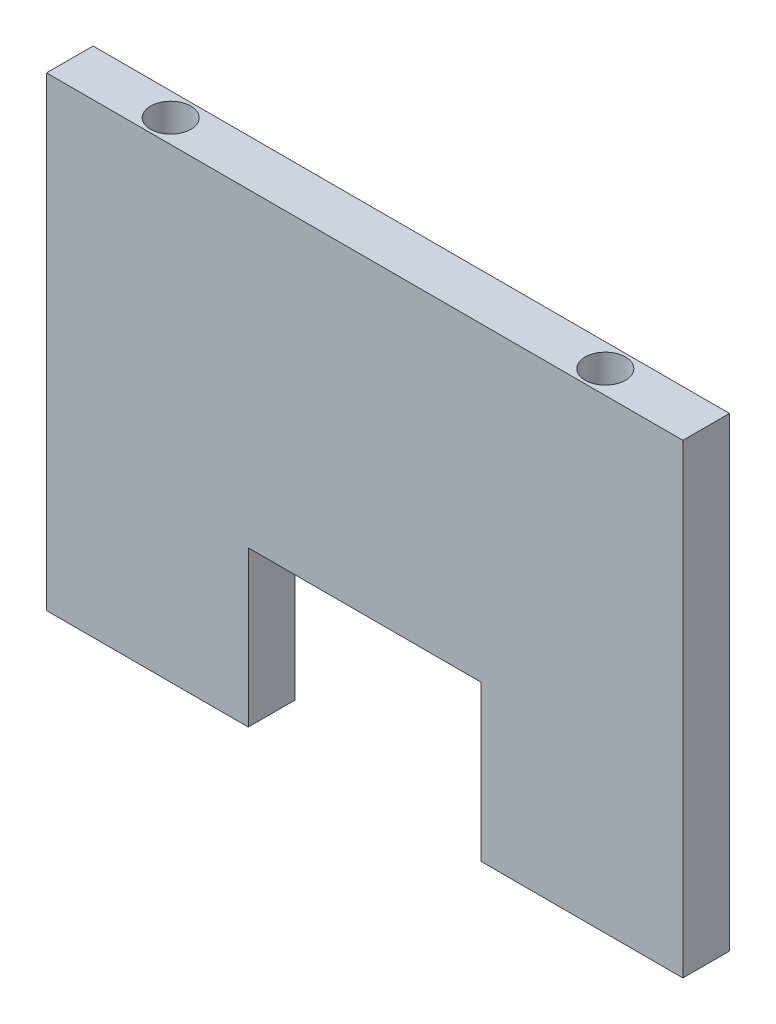
ISO-10303-21;
HEADER;
FILE_DESCRIPTION(('STEP AP214'),'2;1');
FILE_NAME('part.step','',(''),(''),'','','');
FILE_SCHEMA(('AUTOMOTIVE_DESIGN { 1 0 10303 214 1 1 1 1 }'));
ENDSEC;
DATA;
#1=APPLICATION_CONTEXT('core data for automotive mechanical design processes');
#2=APPLICATION_PROTOCOL_DEFINITION('international standard','automotive_design',2000,#1);
#3=PRODUCT_CONTEXT('',#1,'mechanical');
#4=PRODUCT('Part','Part','',(#3));
#5=PRODUCT_RELATED_PRODUCT_CATEGORY('part','',(#4));
#6=PRODUCT_DEFINITION_FORMATION('','',#4);
#7=PRODUCT_DEFINITION_CONTEXT('part definition',#1,'design');
#8=PRODUCT_DEFINITION('design','',#6,#7);
#9=PRODUCT_DEFINITION_SHAPE('','',#8);
#10=(LENGTH_UNIT() NAMED_UNIT(*) SI_UNIT(.MILLI.,.METRE.));
#11=(NAMED_UNIT(*) PLANE_ANGLE_UNIT() SI_UNIT($,.RADIAN.));
#12=(NAMED_UNIT(*) SI_UNIT($,.STERADIAN.) SOLID_ANGLE_UNIT());
#13=UNCERTAINTY_MEASURE_WITH_UNIT(LENGTH_MEASURE(1.E-05),#10,'distance_accuracy_value','');
#14=(GEOMETRIC_REPRESENTATION_CONTEXT(3) GLOBAL_UNCERTAINTY_ASSIGNED_CONTEXT((#13)) GLOBAL_UNIT_ASSIGNED_CONTEXT((#10,
#11,#12)) REPRESENTATION_CONTEXT('',''));
#15=CARTESIAN_POINT('',(0.,0.,0.));
#16=DIRECTION('',(0.,0.,1.));
#17=DIRECTION('',(1.,0.,0.));
#18=AXIS2_PLACEMENT_3D('',#15,#16,#17);
#19=CARTESIAN_POINT('',(0.,0.,3.81));
#20=DIRECTION('',(0.,1.,0.));
#21=DIRECTION('',(0.,0.,1.));
#22=AXIS2_PLACEMENT_3D('',#19,#20,#21);
#23=PLANE('',#22);
#24=CARTESIAN_POINT('',(43.815,0.,1.905));
#25=DIRECTION('',(0.,-1.,0.));
#26=DIRECTION('',(0.,0.,-1.));
#27=AXIS2_PLACEMENT_3D('',#24,#25,#26);
#28=CIRCLE('',#27,1.651);
#29=CARTESIAN_POINT('',(43.815,0.,0.254000000000001));
#30=VERTEX_POINT('',#29);
#31=EDGE_CURVE('E136',#30,#30,#28,.T.);
#32=ORIENTED_EDGE('',*,*,#31,.F.);
#33=EDGE_LOOP('',(#32));
#34=FACE_BOUND('',#33,.T.);
#35=DIRECTION('',(1.,0.,0.));
#36=VECTOR('',#35,1.);
#37=CARTESIAN_POINT('',(0.,0.,3.81));
#38=LINE('',#37,#36);
#39=CARTESIAN_POINT('',(35.56,0.,3.81));
#40=VERTEX_POINT('',#39);
#41=CARTESIAN_POINT('',(52.07,0.,3.81));
#42=VERTEX_POINT('',#41);
#43=EDGE_CURVE('E151',#40,#42,#38,.T.);
#44=ORIENTED_EDGE('',*,*,#43,.F.);
#45=DIRECTION('',(0.,0.,1.));
#46=VECTOR('',#45,1.);
#47=CARTESIAN_POINT('',(35.56,0.,0.));
#48=LINE('',#47,#46);
#49=CARTESIAN_POINT('',(35.56,0.,0.));
#50=VERTEX_POINT('',#49);
#51=EDGE_CURVE('E143',#50,#40,#48,.T.);
#52=ORIENTED_EDGE('',*,*,#51,.F.);
#53=DIRECTION('',(1.,0.,0.));
#54=VECTOR('',#53,1.);
#55=CARTESIAN_POINT('',(0.,0.,0.));
#56=LINE('',#55,#54);
#57=CARTESIAN_POINT('',(52.07,0.,0.));
#58=VERTEX_POINT('',#57);
#59=EDGE_CURVE('E130',#50,#58,#56,.T.);
#60=ORIENTED_EDGE('',*,*,#59,.T.);
#61=DIRECTION('',(0.,0.,-1.));
#62=VECTOR('',#61,1.);
#63=CARTESIAN_POINT('',(52.07,0.,3.81));
#64=LINE('',#63,#62);
#65=EDGE_CURVE('E43',#42,#58,#64,.T.);
#66=ORIENTED_EDGE('',*,*,#65,.F.);
#67=EDGE_LOOP('',(#44,#52,#60,#66));
#68=FACE_BOUND('',#67,.T.);
#69=ADVANCED_FACE('F35',(#34,#68),#23,.F.);
#70=CARTESIAN_POINT('',(0.,0.,3.81));
#71=DIRECTION('',(1.,0.,0.));
#72=DIRECTION('',(0.,0.,-1.));
#73=AXIS2_PLACEMENT_3D('',#70,#71,#72);
#74=PLANE('',#73);
#75=DIRECTION('',(0.,-1.,0.));
#76=VECTOR('',#75,1.);
#77=CARTESIAN_POINT('',(0.,0.,0.));
#78=LINE('',#77,#76);
#79=CARTESIAN_POINT('',(0.,38.1,0.));
#80=VERTEX_POINT('',#79);
#81=CARTESIAN_POINT('',(0.,0.,0.));
#82=VERTEX_POINT('',#81);
#83=EDGE_CURVE('E145',#80,#82,#78,.T.);
#84=ORIENTED_EDGE('',*,*,#83,.T.);
#85=DIRECTION('',(0.,0.,-1.));
#86=VECTOR('',#85,1.);
#87=CARTESIAN_POINT('',(0.,0.,3.81));
#88=LINE('',#87,#86);
#89=CARTESIAN_POINT('',(0.,0.,3.81));
#90=VERTEX_POINT('',#89);
#91=EDGE_CURVE('E11',#90,#82,#88,.T.);
#92=ORIENTED_EDGE('',*,*,#91,.F.);
#93=DIRECTION('',(0.,-1.,0.));
#94=VECTOR('',#93,1.);
#95=CARTESIAN_POINT('',(0.,0.,3.81));
#96=LINE('',#95,#94);
#97=CARTESIAN_POINT('',(0.,38.1,3.81));
#98=VERTEX_POINT('',#97);
#99=EDGE_CURVE('E149',#98,#90,#96,.T.);
#100=ORIENTED_EDGE('',*,*,#99,.F.);
#101=DIRECTION('',(0.,0.,-1.));
#102=VECTOR('',#101,1.);
#103=CARTESIAN_POINT('',(0.,38.1,3.81));
#104=LINE('',#103,#102);
#105=EDGE_CURVE('E156',#98,#80,#104,.T.);
#106=ORIENTED_EDGE('',*,*,#105,.T.);
#107=EDGE_LOOP('',(#84,#92,#100,#106));
#108=FACE_BOUND('',#107,.T.);
#109=ADVANCED_FACE('F37',(#108),#74,.F.);
#110=CARTESIAN_POINT('',(8.255,0.,1.905));
#111=DIRECTION('',(0.,-1.,0.));
#112=DIRECTION('',(0.,0.,-1.));
#113=AXIS2_PLACEMENT_3D('',#110,#111,#112);
#114=CIRCLE('',#113,1.651);
#115=CARTESIAN_POINT('',(8.255,0.,0.254000000000001));
#116=VERTEX_POINT('',#115);
#117=EDGE_CURVE('E206',#116,#116,#114,.T.);
#118=ORIENTED_EDGE('',*,*,#117,.F.);
#119=EDGE_LOOP('',(#118));
#120=FACE_BOUND('',#119,.T.);
#121=CARTESIAN_POINT('',(16.51,0.,0.));
#122=VERTEX_POINT('',#121);
#123=EDGE_CURVE('E159',#82,#122,#56,.T.);
#124=ORIENTED_EDGE('',*,*,#123,.T.);
#125=DIRECTION('',(0.,0.,1.));
#126=VECTOR('',#125,1.);
#127=CARTESIAN_POINT('',(16.51,0.,0.));
#128=LINE('',#127,#126);
#129=CARTESIAN_POINT('',(16.51,0.,3.81));
#130=VERTEX_POINT('',#129);
#131=EDGE_CURVE('E146',#122,#130,#128,.T.);
#132=ORIENTED_EDGE('',*,*,#131,.T.);
#133=EDGE_CURVE('E87',#90,#130,#38,.T.);
#134=ORIENTED_EDGE('',*,*,#133,.F.);
#135=ORIENTED_EDGE('',*,*,#91,.T.);
#136=EDGE_LOOP('',(#124,#132,#134,#135));
#137=FACE_BOUND('',#136,.T.);
#138=ADVANCED_FACE('F189',(#120,#137),#23,.F.);
#139=CARTESIAN_POINT('',(52.07,0.,3.81));
#140=DIRECTION('',(-1.,0.,0.));
#141=DIRECTION('',(0.,0.,1.));
#142=AXIS2_PLACEMENT_3D('',#139,#140,#141);
#143=PLANE('',#142);
#144=DIRECTION('',(0.,1.,0.));
#145=VECTOR('',#144,1.);
#146=CARTESIAN_POINT('',(52.07,0.,0.));
#147=LINE('',#146,#145);
#148=CARTESIAN_POINT('',(52.07,38.1,0.));
#149=VERTEX_POINT('',#148);
#150=EDGE_CURVE('E162',#58,#149,#147,.T.);
#151=ORIENTED_EDGE('',*,*,#150,.T.);
#152=DIRECTION('',(0.,0.,-1.));
#153=VECTOR('',#152,1.);
#154=CARTESIAN_POINT('',(52.07,38.1,3.81));
#155=LINE('',#154,#153);
#156=CARTESIAN_POINT('',(52.07,38.1,3.81));
#157=VERTEX_POINT('',#156);
#158=EDGE_CURVE('E166',#157,#149,#155,.T.);
#159=ORIENTED_EDGE('',*,*,#158,.F.);
#160=DIRECTION('',(0.,1.,0.));
#161=VECTOR('',#160,1.);
#162=CARTESIAN_POINT('',(52.07,0.,3.81));
#163=LINE('',#162,#161);
#164=EDGE_CURVE('E153',#42,#157,#163,.T.);
#165=ORIENTED_EDGE('',*,*,#164,.F.);
#166=ORIENTED_EDGE('',*,*,#65,.T.);
#167=EDGE_LOOP('',(#151,#159,#165,#166));
#168=FACE_BOUND('',#167,.T.);
#169=ADVANCED_FACE('F171',(#168),#143,.F.);
#170=CARTESIAN_POINT('',(0.,38.1,3.81));
#171=DIRECTION('',(0.,-1.,0.));
#172=DIRECTION('',(0.,0.,-1.));
#173=AXIS2_PLACEMENT_3D('',#170,#171,#172);
#174=PLANE('',#173);
#175=CARTESIAN_POINT('',(8.255,38.1,1.905));
#176=DIRECTION('',(0.,1.,0.));
#177=DIRECTION('',(0.,0.,1.));
#178=AXIS2_PLACEMENT_3D('',#175,#176,#177);
#179=CIRCLE('',#178,1.651);
#180=CARTESIAN_POINT('',(8.255,38.1,3.556));
#181=VERTEX_POINT('',#180);
#182=EDGE_CURVE('E338',#181,#181,#179,.T.);
#183=ORIENTED_EDGE('',*,*,#182,.F.);
#184=EDGE_LOOP('',(#183));
#185=FACE_BOUND('',#184,.T.);
#186=CARTESIAN_POINT('',(43.815,38.1,1.905));
#187=DIRECTION('',(0.,1.,0.));
#188=DIRECTION('',(0.,0.,1.));
#189=AXIS2_PLACEMENT_3D('',#186,#187,#188);
#190=CIRCLE('',#189,1.651);
#191=CARTESIAN_POINT('',(43.815,38.1,3.556));
#192=VERTEX_POINT('',#191);
#193=EDGE_CURVE('E348',#192,#192,#190,.T.);
#194=ORIENTED_EDGE('',*,*,#193,.F.);
#195=EDGE_LOOP('',(#194));
#196=FACE_BOUND('',#195,.T.);
#197=DIRECTION('',(-1.,0.,0.));
#198=VECTOR('',#197,1.);
#199=CARTESIAN_POINT('',(0.,38.1,0.));
#200=LINE('',#199,#198);
#201=EDGE_CURVE('E80',#149,#80,#200,.T.);
#202=ORIENTED_EDGE('',*,*,#201,.T.);
#203=ORIENTED_EDGE('',*,*,#105,.F.);
#204=DIRECTION('',(-1.,0.,0.));
#205=VECTOR('',#204,1.);
#206=CARTESIAN_POINT('',(0.,38.1,3.81));
#207=LINE('',#206,#205);
#208=EDGE_CURVE('E59',#157,#98,#207,.T.);
#209=ORIENTED_EDGE('',*,*,#208,.F.);
#210=ORIENTED_EDGE('',*,*,#158,.T.);
#211=EDGE_LOOP('',(#202,#203,#209,#210));
#212=FACE_BOUND('',#211,.T.);
#213=ADVANCED_FACE('F179',(#185,#196,#212),#174,.F.);
#214=CARTESIAN_POINT('',(0.,0.,3.81));
#215=DIRECTION('',(0.,0.,-1.));
#216=DIRECTION('',(-1.,0.,0.));
#217=AXIS2_PLACEMENT_3D('',#214,#215,#216);
#218=PLANE('',#217);
#219=DIRECTION('',(-1.,0.,0.));
#220=VECTOR('',#219,1.);
#221=CARTESIAN_POINT('',(16.51,12.7,3.81));
#222=LINE('',#221,#220);
#223=CARTESIAN_POINT('',(35.56,12.7,3.81));
#224=VERTEX_POINT('',#223);
#225=CARTESIAN_POINT('',(16.51,12.7,3.81));
#226=VERTEX_POINT('',#225);
#227=EDGE_CURVE('E133',#224,#226,#222,.T.);
#228=ORIENTED_EDGE('',*,*,#227,.F.);
#229=DIRECTION('',(0.,1.,0.));
#230=VECTOR('',#229,1.);
#231=CARTESIAN_POINT('',(35.56,12.7,3.81));
#232=LINE('',#231,#230);
#233=EDGE_CURVE('E116',#40,#224,#232,.T.);
#234=ORIENTED_EDGE('',*,*,#233,.F.);
#235=ORIENTED_EDGE('',*,*,#43,.T.);
#236=ORIENTED_EDGE('',*,*,#164,.T.);
#237=ORIENTED_EDGE('',*,*,#208,.T.);
#238=ORIENTED_EDGE('',*,*,#99,.T.);
#239=ORIENTED_EDGE('',*,*,#133,.T.);
#240=DIRECTION('',(0.,-1.,0.));
#241=VECTOR('',#240,1.);
#242=CARTESIAN_POINT('',(16.51,12.7,3.81));
#243=LINE('',#242,#241);
#244=EDGE_CURVE('E131',#226,#130,#243,.T.);
#245=ORIENTED_EDGE('',*,*,#244,.F.);
#246=EDGE_LOOP('',(#228,#234,#235,#236,#237,#238,#239,#245));
#247=FACE_BOUND('',#246,.T.);
#248=ADVANCED_FACE('F181',(#247),#218,.F.);
#249=CARTESIAN_POINT('',(0.,0.,0.));
#250=DIRECTION('',(0.,0.,-1.));
#251=DIRECTION('',(-1.,0.,0.));
#252=AXIS2_PLACEMENT_3D('',#249,#250,#251);
#253=PLANE('',#252);
#254=DIRECTION('',(0.,1.,0.));
#255=VECTOR('',#254,1.);
#256=CARTESIAN_POINT('',(35.56,12.7,0.));
#257=LINE('',#256,#255);
#258=CARTESIAN_POINT('',(35.56,12.7,0.));
#259=VERTEX_POINT('',#258);
#260=EDGE_CURVE('E113',#50,#259,#257,.T.);
#261=ORIENTED_EDGE('',*,*,#260,.T.);
#262=DIRECTION('',(-1.,0.,0.));
#263=VECTOR('',#262,1.);
#264=CARTESIAN_POINT('',(16.51,12.7,0.));
#265=LINE('',#264,#263);
#266=CARTESIAN_POINT('',(16.51,12.7,0.));
#267=VERTEX_POINT('',#266);
#268=EDGE_CURVE('E123',#259,#267,#265,.T.);
#269=ORIENTED_EDGE('',*,*,#268,.T.);
#270=DIRECTION('',(0.,-1.,0.));
#271=VECTOR('',#270,1.);
#272=CARTESIAN_POINT('',(16.51,12.7,0.));
#273=LINE('',#272,#271);
#274=EDGE_CURVE('E50',#267,#122,#273,.T.);
#275=ORIENTED_EDGE('',*,*,#274,.T.);
#276=ORIENTED_EDGE('',*,*,#123,.F.);
#277=ORIENTED_EDGE('',*,*,#83,.F.);
#278=ORIENTED_EDGE('',*,*,#201,.F.);
#279=ORIENTED_EDGE('',*,*,#150,.F.);
#280=ORIENTED_EDGE('',*,*,#59,.F.);
#281=EDGE_LOOP('',(#261,#269,#275,#276,#277,#278,#279,#280));
#282=FACE_BOUND('',#281,.T.);
#283=ADVANCED_FACE('F128',(#282),#253,.T.);
#284=CARTESIAN_POINT('',(35.56,12.7,0.));
#285=DIRECTION('',(1.,0.,0.));
#286=DIRECTION('',(0.,0.,-1.));
#287=AXIS2_PLACEMENT_3D('',#284,#285,#286);
#288=PLANE('',#287);
#289=ORIENTED_EDGE('',*,*,#233,.T.);
#290=DIRECTION('',(0.,0.,1.));
#291=VECTOR('',#290,1.);
#292=CARTESIAN_POINT('',(35.56,12.7,0.));
#293=LINE('',#292,#291);
#294=EDGE_CURVE('E109',#259,#224,#293,.T.);
#295=ORIENTED_EDGE('',*,*,#294,.F.);
#296=ORIENTED_EDGE('',*,*,#260,.F.);
#297=ORIENTED_EDGE('',*,*,#51,.T.);
#298=EDGE_LOOP('',(#289,#295,#296,#297));
#299=FACE_BOUND('',#298,.T.);
#300=ADVANCED_FACE('F111',(#299),#288,.F.);
#301=CARTESIAN_POINT('',(16.51,12.7,0.));
#302=DIRECTION('',(-1.,0.,0.));
#303=DIRECTION('',(0.,0.,1.));
#304=AXIS2_PLACEMENT_3D('',#301,#302,#303);
#305=PLANE('',#304);
#306=ORIENTED_EDGE('',*,*,#244,.T.);
#307=ORIENTED_EDGE('',*,*,#131,.F.);
#308=ORIENTED_EDGE('',*,*,#274,.F.);
#309=DIRECTION('',(0.,0.,1.));
#310=VECTOR('',#309,1.);
#311=CARTESIAN_POINT('',(16.51,12.7,0.));
#312=LINE('',#311,#310);
#313=EDGE_CURVE('E120',#267,#226,#312,.T.);
#314=ORIENTED_EDGE('',*,*,#313,.T.);
#315=EDGE_LOOP('',(#306,#307,#308,#314));
#316=FACE_BOUND('',#315,.T.);
#317=ADVANCED_FACE('F208',(#316),#305,.F.);
#318=CARTESIAN_POINT('',(16.51,12.7,0.));
#319=DIRECTION('',(0.,1.,0.));
#320=DIRECTION('',(0.,0.,1.));
#321=AXIS2_PLACEMENT_3D('',#318,#319,#320);
#322=PLANE('',#321);
#323=ORIENTED_EDGE('',*,*,#227,.T.);
#324=ORIENTED_EDGE('',*,*,#313,.F.);
#325=ORIENTED_EDGE('',*,*,#268,.F.);
#326=ORIENTED_EDGE('',*,*,#294,.T.);
#327=EDGE_LOOP('',(#323,#324,#325,#326));
#328=FACE_BOUND('',#327,.T.);
#329=ADVANCED_FACE('F124',(#328),#322,.F.);
#330=CARTESIAN_POINT('',(8.255,5.08,1.905));
#331=DIRECTION('',(0.,-1.,0.));
#332=DIRECTION('',(0.,0.,-1.));
#333=AXIS2_PLACEMENT_3D('',#330,#331,#332);
#334=CYLINDRICAL_SURFACE('',#333,1.651);
#335=CARTESIAN_POINT('',(8.255,5.08,1.905));
#336=DIRECTION('',(0.,-1.,0.));
#337=DIRECTION('',(0.,0.,-1.));
#338=AXIS2_PLACEMENT_3D('',#335,#336,#337);
#339=CIRCLE('',#338,1.651);
#340=CARTESIAN_POINT('',(8.255,5.08,0.254000000000001));
#341=VERTEX_POINT('',#340);
#342=EDGE_CURVE('E141',#341,#341,#339,.T.);
#343=ORIENTED_EDGE('',*,*,#342,.F.);
#344=EDGE_LOOP('',(#343));
#345=FACE_BOUND('',#344,.T.);
#346=ORIENTED_EDGE('',*,*,#117,.T.);
#347=EDGE_LOOP('',(#346));
#348=FACE_BOUND('',#347,.T.);
#349=ADVANCED_FACE('F215',(#345,#348),#334,.F.);
#350=CARTESIAN_POINT('',(8.255,5.08,1.905));
#351=DIRECTION('',(0.,-1.,0.));
#352=DIRECTION('',(0.,0.,-1.));
#353=AXIS2_PLACEMENT_3D('',#350,#351,#352);
#354=PLANE('',#353);
#355=ORIENTED_EDGE('',*,*,#342,.T.);
#356=EDGE_LOOP('',(#355));
#357=FACE_BOUND('',#356,.T.);
#358=ADVANCED_FACE('F259',(#357),#354,.T.);
#359=CARTESIAN_POINT('',(43.815,5.08,1.905));
#360=DIRECTION('',(0.,-1.,0.));
#361=DIRECTION('',(0.,0.,-1.));
#362=AXIS2_PLACEMENT_3D('',#359,#360,#361);
#363=CYLINDRICAL_SURFACE('',#362,1.651);
#364=CARTESIAN_POINT('',(43.815,5.08,1.905));
#365=DIRECTION('',(0.,-1.,0.));
#366=DIRECTION('',(0.,0.,-1.));
#367=AXIS2_PLACEMENT_3D('',#364,#365,#366);
#368=CIRCLE('',#367,1.651);
#369=CARTESIAN_POINT('',(43.815,5.08,0.254000000000001));
#370=VERTEX_POINT('',#369);
#371=EDGE_CURVE('E341',#370,#370,#368,.T.);
#372=ORIENTED_EDGE('',*,*,#371,.F.);
#373=EDGE_LOOP('',(#372));
#374=FACE_BOUND('',#373,.T.);
#375=ORIENTED_EDGE('',*,*,#31,.T.);
#376=EDGE_LOOP('',(#375));
#377=FACE_BOUND('',#376,.T.);
#378=ADVANCED_FACE('F219',(#374,#377),#363,.F.);
#379=CARTESIAN_POINT('',(43.815,5.08,1.905));
#380=DIRECTION('',(0.,-1.,0.));
#381=DIRECTION('',(0.,0.,-1.));
#382=AXIS2_PLACEMENT_3D('',#379,#380,#381);
#383=PLANE('',#382);
#384=ORIENTED_EDGE('',*,*,#371,.T.);
#385=EDGE_LOOP('',(#384));
#386=FACE_BOUND('',#385,.T.);
#387=ADVANCED_FACE('F278',(#386),#383,.T.);
#388=CARTESIAN_POINT('',(43.815,33.02,1.905));
#389=DIRECTION('',(0.,1.,0.));
#390=DIRECTION('',(0.,0.,1.));
#391=AXIS2_PLACEMENT_3D('',#388,#389,#390);
#392=CYLINDRICAL_SURFACE('',#391,1.651);
#393=CARTESIAN_POINT('',(43.815,33.02,1.905));
#394=DIRECTION('',(0.,1.,0.));
#395=DIRECTION('',(0.,0.,1.));
#396=AXIS2_PLACEMENT_3D('',#393,#394,#395);
#397=CIRCLE('',#396,1.651);
#398=CARTESIAN_POINT('',(43.815,33.02,3.556));
#399=VERTEX_POINT('',#398);
#400=EDGE_CURVE('E343',#399,#399,#397,.T.);
#401=ORIENTED_EDGE('',*,*,#400,.F.);
#402=EDGE_LOOP('',(#401));
#403=FACE_BOUND('',#402,.T.);
#404=ORIENTED_EDGE('',*,*,#193,.T.);
#405=EDGE_LOOP('',(#404));
#406=FACE_BOUND('',#405,.T.);
#407=ADVANCED_FACE('F286',(#403,#406),#392,.F.);
#408=CARTESIAN_POINT('',(43.815,33.02,1.905));
#409=DIRECTION('',(0.,1.,0.));
#410=DIRECTION('',(0.,0.,1.));
#411=AXIS2_PLACEMENT_3D('',#408,#409,#410);
#412=PLANE('',#411);
#413=ORIENTED_EDGE('',*,*,#400,.T.);
#414=EDGE_LOOP('',(#413));
#415=FACE_BOUND('',#414,.T.);
#416=ADVANCED_FACE('F301',(#415),#412,.T.);
#417=CARTESIAN_POINT('',(8.255,33.02,1.905));
#418=DIRECTION('',(0.,1.,0.));
#419=DIRECTION('',(0.,0.,1.));
#420=AXIS2_PLACEMENT_3D('',#417,#418,#419);
#421=CYLINDRICAL_SURFACE('',#420,1.651);
#422=CARTESIAN_POINT('',(8.255,33.02,1.905));
#423=DIRECTION('',(0.,1.,0.));
#424=DIRECTION('',(0.,0.,1.));
#425=AXIS2_PLACEMENT_3D('',#422,#423,#424);
#426=CIRCLE('',#425,1.651);
#427=CARTESIAN_POINT('',(8.255,33.02,3.556));
#428=VERTEX_POINT('',#427);
#429=EDGE_CURVE('E337',#428,#428,#426,.T.);
#430=ORIENTED_EDGE('',*,*,#429,.F.);
#431=EDGE_LOOP('',(#430));
#432=FACE_BOUND('',#431,.T.);
#433=ORIENTED_EDGE('',*,*,#182,.T.);
#434=EDGE_LOOP('',(#433));
#435=FACE_BOUND('',#434,.T.);
#436=ADVANCED_FACE('F311',(#432,#435),#421,.F.);
#437=CARTESIAN_POINT('',(8.255,33.02,1.905));
#438=DIRECTION('',(0.,1.,0.));
#439=DIRECTION('',(0.,0.,1.));
#440=AXIS2_PLACEMENT_3D('',#437,#438,#439);
#441=PLANE('',#440);
#442=ORIENTED_EDGE('',*,*,#429,.T.);
#443=EDGE_LOOP('',(#442));
#444=FACE_BOUND('',#443,.T.);
#445=ADVANCED_FACE('F321',(#444),#441,.T.);
#446=CLOSED_SHELL('',(#69,#109,#138,#169,#213,#248,#283,#300,#317,#329,#349,#358,#378,#387,#407,
#416,#436,#445));
#447=MANIFOLD_SOLID_BREP('B2',#446);
#448=ADVANCED_BREP_SHAPE_REPRESENTATION('',(#18,#447),#14);
#449=SHAPE_DEFINITION_REPRESENTATION(#9,#448);
ENDSEC;
END-ISO-10303-21;
